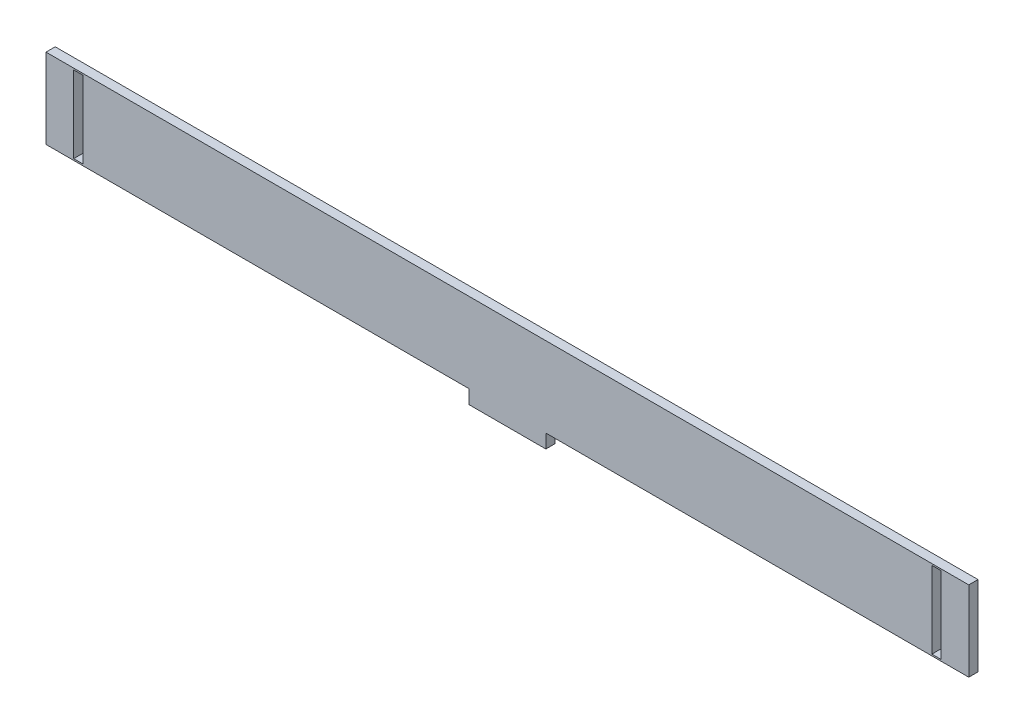
ISO-10303-21;
HEADER;
FILE_DESCRIPTION(('STEP AP214'),'2;1');
FILE_NAME('part.step','',(''),(''),'','','');
FILE_SCHEMA(('AUTOMOTIVE_DESIGN { 1 0 10303 214 1 1 1 1 }'));
ENDSEC;
DATA;
#1=APPLICATION_CONTEXT('core data for automotive mechanical design processes');
#2=APPLICATION_PROTOCOL_DEFINITION('international standard','automotive_design',2000,#1);
#3=PRODUCT_CONTEXT('',#1,'mechanical');
#4=PRODUCT('Part','Part','',(#3));
#5=PRODUCT_RELATED_PRODUCT_CATEGORY('part','',(#4));
#6=PRODUCT_DEFINITION_FORMATION('','',#4);
#7=PRODUCT_DEFINITION_CONTEXT('part definition',#1,'design');
#8=PRODUCT_DEFINITION('design','',#6,#7);
#9=PRODUCT_DEFINITION_SHAPE('','',#8);
#10=(LENGTH_UNIT() NAMED_UNIT(*) SI_UNIT(.MILLI.,.METRE.));
#11=(NAMED_UNIT(*) PLANE_ANGLE_UNIT() SI_UNIT($,.RADIAN.));
#12=(NAMED_UNIT(*) SI_UNIT($,.STERADIAN.) SOLID_ANGLE_UNIT());
#13=UNCERTAINTY_MEASURE_WITH_UNIT(LENGTH_MEASURE(1.E-05),#10,'distance_accuracy_value','');
#14=(GEOMETRIC_REPRESENTATION_CONTEXT(3) GLOBAL_UNCERTAINTY_ASSIGNED_CONTEXT((#13)) GLOBAL_UNIT_ASSIGNED_CONTEXT((#10,
#11,#12)) REPRESENTATION_CONTEXT('',''));
#15=CARTESIAN_POINT('',(0.,0.,0.));
#16=DIRECTION('',(0.,0.,1.));
#17=DIRECTION('',(1.,0.,0.));
#18=AXIS2_PLACEMENT_3D('',#15,#16,#17);
#19=CARTESIAN_POINT('',(0.,0.,6.));
#20=DIRECTION('',(0.,0.,1.));
#21=DIRECTION('',(1.,0.,0.));
#22=AXIS2_PLACEMENT_3D('',#19,#20,#21);
#23=PLANE('',#22);
#24=DIRECTION('',(0.,-1.,0.));
#25=VECTOR('',#24,1.);
#26=CARTESIAN_POINT('',(0.,0.,6.));
#27=LINE('',#26,#25);
#28=CARTESIAN_POINT('',(0.,0.,6.));
#29=VERTEX_POINT('',#28);
#30=CARTESIAN_POINT('',(0.,-52.,6.));
#31=VERTEX_POINT('',#30);
#32=EDGE_CURVE('E215',#29,#31,#27,.T.);
#33=ORIENTED_EDGE('',*,*,#32,.T.);
#34=DIRECTION('',(1.,0.,0.));
#35=VECTOR('',#34,1.);
#36=CARTESIAN_POINT('',(0.,-52.,6.));
#37=LINE('',#36,#35);
#38=CARTESIAN_POINT('',(275.,-52.,6.));
#39=VERTEX_POINT('',#38);
#40=EDGE_CURVE('E218',#31,#39,#37,.T.);
#41=ORIENTED_EDGE('',*,*,#40,.T.);
#42=DIRECTION('',(0.,-1.,0.));
#43=VECTOR('',#42,1.);
#44=CARTESIAN_POINT('',(275.,-52.,6.));
#45=LINE('',#44,#43);
#46=CARTESIAN_POINT('',(275.,-61.,6.));
#47=VERTEX_POINT('',#46);
#48=EDGE_CURVE('E221',#39,#47,#45,.T.);
#49=ORIENTED_EDGE('',*,*,#48,.T.);
#50=DIRECTION('',(1.,0.,0.));
#51=VECTOR('',#50,1.);
#52=CARTESIAN_POINT('',(275.,-61.,6.));
#53=LINE('',#52,#51);
#54=CARTESIAN_POINT('',(325.,-61.,6.));
#55=VERTEX_POINT('',#54);
#56=EDGE_CURVE('E223',#47,#55,#53,.T.);
#57=ORIENTED_EDGE('',*,*,#56,.T.);
#58=DIRECTION('',(0.,1.,0.));
#59=VECTOR('',#58,1.);
#60=CARTESIAN_POINT('',(325.,-52.,6.));
#61=LINE('',#60,#59);
#62=CARTESIAN_POINT('',(325.,-52.,6.));
#63=VERTEX_POINT('',#62);
#64=EDGE_CURVE('E225',#55,#63,#61,.T.);
#65=ORIENTED_EDGE('',*,*,#64,.T.);
#66=DIRECTION('',(1.,0.,0.));
#67=VECTOR('',#66,1.);
#68=CARTESIAN_POINT('',(325.,-52.,6.));
#69=LINE('',#68,#67);
#70=CARTESIAN_POINT('',(600.,-51.9999999999999,6.));
#71=VERTEX_POINT('',#70);
#72=EDGE_CURVE('E227',#63,#71,#69,.T.);
#73=ORIENTED_EDGE('',*,*,#72,.T.);
#74=DIRECTION('',(0.,1.,0.));
#75=VECTOR('',#74,1.);
#76=CARTESIAN_POINT('',(600.,0.,6.));
#77=LINE('',#76,#75);
#78=CARTESIAN_POINT('',(600.,0.,6.));
#79=VERTEX_POINT('',#78);
#80=EDGE_CURVE('E229',#71,#79,#77,.T.);
#81=ORIENTED_EDGE('',*,*,#80,.T.);
#82=DIRECTION('',(-1.,0.,0.));
#83=VECTOR('',#82,1.);
#84=CARTESIAN_POINT('',(0.,0.,6.));
#85=LINE('',#84,#83);
#86=EDGE_CURVE('E231',#79,#29,#85,.T.);
#87=ORIENTED_EDGE('',*,*,#86,.T.);
#88=EDGE_LOOP('',(#33,#41,#49,#57,#65,#73,#81,#87));
#89=FACE_BOUND('',#88,.T.);
#90=DIRECTION('',(-1.,0.,0.));
#91=VECTOR('',#90,1.);
#92=CARTESIAN_POINT('',(18.,-0.999999999999928,6.));
#93=LINE('',#92,#91);
#94=CARTESIAN_POINT('',(24.,-0.999999999999929,6.));
#95=VERTEX_POINT('',#94);
#96=CARTESIAN_POINT('',(18.,-0.999999999999928,6.));
#97=VERTEX_POINT('',#96);
#98=EDGE_CURVE('E186',#95,#97,#93,.T.);
#99=ORIENTED_EDGE('',*,*,#98,.F.);
#100=DIRECTION('',(0.,1.,0.));
#101=VECTOR('',#100,1.);
#102=CARTESIAN_POINT('',(24.,-0.999999999999929,6.));
#103=LINE('',#102,#101);
#104=CARTESIAN_POINT('',(24.,-50.9999999999999,6.));
#105=VERTEX_POINT('',#104);
#106=EDGE_CURVE('E184',#105,#95,#103,.T.);
#107=ORIENTED_EDGE('',*,*,#106,.F.);
#108=DIRECTION('',(1.,0.,0.));
#109=VECTOR('',#108,1.);
#110=CARTESIAN_POINT('',(18.,-50.9999999999999,6.));
#111=LINE('',#110,#109);
#112=CARTESIAN_POINT('',(18.,-50.9999999999999,6.));
#113=VERTEX_POINT('',#112);
#114=EDGE_CURVE('E192',#113,#105,#111,.T.);
#115=ORIENTED_EDGE('',*,*,#114,.F.);
#116=DIRECTION('',(0.,-1.,0.));
#117=VECTOR('',#116,1.);
#118=CARTESIAN_POINT('',(18.,-0.999999999999928,6.));
#119=LINE('',#118,#117);
#120=EDGE_CURVE('E189',#97,#113,#119,.T.);
#121=ORIENTED_EDGE('',*,*,#120,.F.);
#122=EDGE_LOOP('',(#99,#107,#115,#121));
#123=FACE_BOUND('',#122,.T.);
#124=DIRECTION('',(-1.,0.,0.));
#125=VECTOR('',#124,1.);
#126=CARTESIAN_POINT('',(582.,-0.999999999999859,6.));
#127=LINE('',#126,#125);
#128=CARTESIAN_POINT('',(582.,-0.999999999999859,6.));
#129=VERTEX_POINT('',#128);
#130=CARTESIAN_POINT('',(576.,-0.999999999999861,6.));
#131=VERTEX_POINT('',#130);
#132=EDGE_CURVE('E156',#129,#131,#127,.T.);
#133=ORIENTED_EDGE('',*,*,#132,.F.);
#134=DIRECTION('',(0.,1.,0.));
#135=VECTOR('',#134,1.);
#136=CARTESIAN_POINT('',(582.,-0.999999999999859,6.));
#137=LINE('',#136,#135);
#138=CARTESIAN_POINT('',(582.,-50.9999999999999,6.));
#139=VERTEX_POINT('',#138);
#140=EDGE_CURVE('E148',#139,#129,#137,.T.);
#141=ORIENTED_EDGE('',*,*,#140,.F.);
#142=DIRECTION('',(1.,0.,0.));
#143=VECTOR('',#142,1.);
#144=CARTESIAN_POINT('',(582.,-50.9999999999999,6.));
#145=LINE('',#144,#143);
#146=CARTESIAN_POINT('',(576.,-50.9999999999999,6.));
#147=VERTEX_POINT('',#146);
#148=EDGE_CURVE('E170',#147,#139,#145,.T.);
#149=ORIENTED_EDGE('',*,*,#148,.F.);
#150=DIRECTION('',(0.,-1.,0.));
#151=VECTOR('',#150,1.);
#152=CARTESIAN_POINT('',(576.,-0.999999999999861,6.));
#153=LINE('',#152,#151);
#154=EDGE_CURVE('E168',#131,#147,#153,.T.);
#155=ORIENTED_EDGE('',*,*,#154,.F.);
#156=EDGE_LOOP('',(#133,#141,#149,#155));
#157=FACE_BOUND('',#156,.T.);
#158=ADVANCED_FACE('F35',(#89,#123,#157),#23,.T.);
#159=CARTESIAN_POINT('',(0.,0.,0.));
#160=DIRECTION('',(0.,0.,1.));
#161=DIRECTION('',(1.,0.,0.));
#162=AXIS2_PLACEMENT_3D('',#159,#160,#161);
#163=PLANE('',#162);
#164=DIRECTION('',(0.,1.,0.));
#165=VECTOR('',#164,1.);
#166=CARTESIAN_POINT('',(24.,-0.999999999999929,0.));
#167=LINE('',#166,#165);
#168=CARTESIAN_POINT('',(24.,-50.9999999999999,0.));
#169=VERTEX_POINT('',#168);
#170=CARTESIAN_POINT('',(24.,-0.999999999999929,0.));
#171=VERTEX_POINT('',#170);
#172=EDGE_CURVE('E164',#169,#171,#167,.T.);
#173=ORIENTED_EDGE('',*,*,#172,.T.);
#174=DIRECTION('',(-1.,0.,0.));
#175=VECTOR('',#174,1.);
#176=CARTESIAN_POINT('',(18.,-0.999999999999928,0.));
#177=LINE('',#176,#175);
#178=CARTESIAN_POINT('',(18.,-0.999999999999928,0.));
#179=VERTEX_POINT('',#178);
#180=EDGE_CURVE('E197',#171,#179,#177,.T.);
#181=ORIENTED_EDGE('',*,*,#180,.T.);
#182=DIRECTION('',(0.,-1.,0.));
#183=VECTOR('',#182,1.);
#184=CARTESIAN_POINT('',(18.,-0.999999999999928,0.));
#185=LINE('',#184,#183);
#186=CARTESIAN_POINT('',(18.,-50.9999999999999,0.));
#187=VERTEX_POINT('',#186);
#188=EDGE_CURVE('E200',#179,#187,#185,.T.);
#189=ORIENTED_EDGE('',*,*,#188,.T.);
#190=DIRECTION('',(1.,0.,0.));
#191=VECTOR('',#190,1.);
#192=CARTESIAN_POINT('',(18.,-50.9999999999999,0.));
#193=LINE('',#192,#191);
#194=EDGE_CURVE('E187',#187,#169,#193,.T.);
#195=ORIENTED_EDGE('',*,*,#194,.T.);
#196=EDGE_LOOP('',(#173,#181,#189,#195));
#197=FACE_BOUND('',#196,.T.);
#198=DIRECTION('',(0.,-1.,0.));
#199=VECTOR('',#198,1.);
#200=CARTESIAN_POINT('',(0.,0.,0.));
#201=LINE('',#200,#199);
#202=CARTESIAN_POINT('',(0.,0.,0.));
#203=VERTEX_POINT('',#202);
#204=CARTESIAN_POINT('',(0.,-52.,0.));
#205=VERTEX_POINT('',#204);
#206=EDGE_CURVE('E214',#203,#205,#201,.T.);
#207=ORIENTED_EDGE('',*,*,#206,.F.);
#208=DIRECTION('',(-1.,0.,0.));
#209=VECTOR('',#208,1.);
#210=CARTESIAN_POINT('',(0.,0.,0.));
#211=LINE('',#210,#209);
#212=CARTESIAN_POINT('',(600.,0.,0.));
#213=VERTEX_POINT('',#212);
#214=EDGE_CURVE('E219',#213,#203,#211,.T.);
#215=ORIENTED_EDGE('',*,*,#214,.F.);
#216=DIRECTION('',(0.,1.,0.));
#217=VECTOR('',#216,1.);
#218=CARTESIAN_POINT('',(600.,0.,0.));
#219=LINE('',#218,#217);
#220=CARTESIAN_POINT('',(600.,-51.9999999999999,0.));
#221=VERTEX_POINT('',#220);
#222=EDGE_CURVE('E246',#221,#213,#219,.T.);
#223=ORIENTED_EDGE('',*,*,#222,.F.);
#224=DIRECTION('',(1.,0.,0.));
#225=VECTOR('',#224,1.);
#226=CARTESIAN_POINT('',(325.,-52.,0.));
#227=LINE('',#226,#225);
#228=CARTESIAN_POINT('',(325.,-52.,0.));
#229=VERTEX_POINT('',#228);
#230=EDGE_CURVE('E244',#229,#221,#227,.T.);
#231=ORIENTED_EDGE('',*,*,#230,.F.);
#232=DIRECTION('',(0.,1.,0.));
#233=VECTOR('',#232,1.);
#234=CARTESIAN_POINT('',(325.,-52.,0.));
#235=LINE('',#234,#233);
#236=CARTESIAN_POINT('',(325.,-61.,0.));
#237=VERTEX_POINT('',#236);
#238=EDGE_CURVE('E242',#237,#229,#235,.T.);
#239=ORIENTED_EDGE('',*,*,#238,.F.);
#240=DIRECTION('',(1.,0.,0.));
#241=VECTOR('',#240,1.);
#242=CARTESIAN_POINT('',(275.,-61.,0.));
#243=LINE('',#242,#241);
#244=CARTESIAN_POINT('',(275.,-61.,0.));
#245=VERTEX_POINT('',#244);
#246=EDGE_CURVE('E240',#245,#237,#243,.T.);
#247=ORIENTED_EDGE('',*,*,#246,.F.);
#248=DIRECTION('',(0.,-1.,0.));
#249=VECTOR('',#248,1.);
#250=CARTESIAN_POINT('',(275.,-52.,0.));
#251=LINE('',#250,#249);
#252=CARTESIAN_POINT('',(275.,-52.,0.));
#253=VERTEX_POINT('',#252);
#254=EDGE_CURVE('E238',#253,#245,#251,.T.);
#255=ORIENTED_EDGE('',*,*,#254,.F.);
#256=DIRECTION('',(1.,0.,0.));
#257=VECTOR('',#256,1.);
#258=CARTESIAN_POINT('',(0.,-52.,0.));
#259=LINE('',#258,#257);
#260=EDGE_CURVE('E236',#205,#253,#259,.T.);
#261=ORIENTED_EDGE('',*,*,#260,.F.);
#262=EDGE_LOOP('',(#207,#215,#223,#231,#239,#247,#255,#261));
#263=FACE_BOUND('',#262,.T.);
#264=DIRECTION('',(0.,1.,0.));
#265=VECTOR('',#264,1.);
#266=CARTESIAN_POINT('',(582.,-0.999999999999859,0.));
#267=LINE('',#266,#265);
#268=CARTESIAN_POINT('',(582.,-50.9999999999999,0.));
#269=VERTEX_POINT('',#268);
#270=CARTESIAN_POINT('',(582.,-0.999999999999859,0.));
#271=VERTEX_POINT('',#270);
#272=EDGE_CURVE('E58',#269,#271,#267,.T.);
#273=ORIENTED_EDGE('',*,*,#272,.T.);
#274=DIRECTION('',(-1.,0.,0.));
#275=VECTOR('',#274,1.);
#276=CARTESIAN_POINT('',(582.,-0.999999999999859,0.));
#277=LINE('',#276,#275);
#278=CARTESIAN_POINT('',(576.,-0.999999999999861,0.));
#279=VERTEX_POINT('',#278);
#280=EDGE_CURVE('E163',#271,#279,#277,.T.);
#281=ORIENTED_EDGE('',*,*,#280,.T.);
#282=DIRECTION('',(0.,-1.,0.));
#283=VECTOR('',#282,1.);
#284=CARTESIAN_POINT('',(576.,-0.999999999999861,0.));
#285=LINE('',#284,#283);
#286=CARTESIAN_POINT('',(576.,-50.9999999999999,0.));
#287=VERTEX_POINT('',#286);
#288=EDGE_CURVE('E176',#279,#287,#285,.T.);
#289=ORIENTED_EDGE('',*,*,#288,.T.);
#290=DIRECTION('',(1.,0.,0.));
#291=VECTOR('',#290,1.);
#292=CARTESIAN_POINT('',(582.,-50.9999999999999,0.));
#293=LINE('',#292,#291);
#294=EDGE_CURVE('E157',#287,#269,#293,.T.);
#295=ORIENTED_EDGE('',*,*,#294,.T.);
#296=EDGE_LOOP('',(#273,#281,#289,#295));
#297=FACE_BOUND('',#296,.T.);
#298=ADVANCED_FACE('F276',(#197,#263,#297),#163,.F.);
#299=CARTESIAN_POINT('',(0.,0.,6.));
#300=DIRECTION('',(1.,0.,0.));
#301=DIRECTION('',(0.,1.,0.));
#302=AXIS2_PLACEMENT_3D('',#299,#300,#301);
#303=PLANE('',#302);
#304=ORIENTED_EDGE('',*,*,#206,.T.);
#305=DIRECTION('',(0.,0.,-1.));
#306=VECTOR('',#305,1.);
#307=CARTESIAN_POINT('',(0.,-52.,6.));
#308=LINE('',#307,#306);
#309=EDGE_CURVE('E11',#31,#205,#308,.T.);
#310=ORIENTED_EDGE('',*,*,#309,.F.);
#311=ORIENTED_EDGE('',*,*,#32,.F.);
#312=DIRECTION('',(0.,0.,-1.));
#313=VECTOR('',#312,1.);
#314=CARTESIAN_POINT('',(0.,0.,6.));
#315=LINE('',#314,#313);
#316=EDGE_CURVE('E233',#29,#203,#315,.T.);
#317=ORIENTED_EDGE('',*,*,#316,.T.);
#318=EDGE_LOOP('',(#304,#310,#311,#317));
#319=FACE_BOUND('',#318,.T.);
#320=ADVANCED_FACE('F37',(#319),#303,.F.);
#321=CARTESIAN_POINT('',(0.,-52.,6.));
#322=DIRECTION('',(0.,1.,0.));
#323=DIRECTION('',(0.,0.,1.));
#324=AXIS2_PLACEMENT_3D('',#321,#322,#323);
#325=PLANE('',#324);
#326=ORIENTED_EDGE('',*,*,#260,.T.);
#327=DIRECTION('',(0.,0.,-1.));
#328=VECTOR('',#327,1.);
#329=CARTESIAN_POINT('',(275.,-52.,6.));
#330=LINE('',#329,#328);
#331=EDGE_CURVE('E43',#39,#253,#330,.T.);
#332=ORIENTED_EDGE('',*,*,#331,.F.);
#333=ORIENTED_EDGE('',*,*,#40,.F.);
#334=ORIENTED_EDGE('',*,*,#309,.T.);
#335=EDGE_LOOP('',(#326,#332,#333,#334));
#336=FACE_BOUND('',#335,.T.);
#337=ADVANCED_FACE('F294',(#336),#325,.F.);
#338=CARTESIAN_POINT('',(275.,-52.,6.));
#339=DIRECTION('',(1.,0.,0.));
#340=DIRECTION('',(0.,1.,0.));
#341=AXIS2_PLACEMENT_3D('',#338,#339,#340);
#342=PLANE('',#341);
#343=ORIENTED_EDGE('',*,*,#254,.T.);
#344=DIRECTION('',(0.,0.,-1.));
#345=VECTOR('',#344,1.);
#346=CARTESIAN_POINT('',(275.,-61.,6.));
#347=LINE('',#346,#345);
#348=EDGE_CURVE('E263',#47,#245,#347,.T.);
#349=ORIENTED_EDGE('',*,*,#348,.F.);
#350=ORIENTED_EDGE('',*,*,#48,.F.);
#351=ORIENTED_EDGE('',*,*,#331,.T.);
#352=EDGE_LOOP('',(#343,#349,#350,#351));
#353=FACE_BOUND('',#352,.T.);
#354=ADVANCED_FACE('F270',(#353),#342,.F.);
#355=CARTESIAN_POINT('',(275.,-61.,6.));
#356=DIRECTION('',(0.,1.,0.));
#357=DIRECTION('',(-1.,0.,0.));
#358=AXIS2_PLACEMENT_3D('',#355,#356,#357);
#359=PLANE('',#358);
#360=ORIENTED_EDGE('',*,*,#246,.T.);
#361=DIRECTION('',(0.,0.,-1.));
#362=VECTOR('',#361,1.);
#363=CARTESIAN_POINT('',(325.,-61.,6.));
#364=LINE('',#363,#362);
#365=EDGE_CURVE('E260',#55,#237,#364,.T.);
#366=ORIENTED_EDGE('',*,*,#365,.F.);
#367=ORIENTED_EDGE('',*,*,#56,.F.);
#368=ORIENTED_EDGE('',*,*,#348,.T.);
#369=EDGE_LOOP('',(#360,#366,#367,#368));
#370=FACE_BOUND('',#369,.T.);
#371=ADVANCED_FACE('F282',(#370),#359,.F.);
#372=CARTESIAN_POINT('',(325.,-52.,6.));
#373=DIRECTION('',(-1.,0.,0.));
#374=DIRECTION('',(0.,0.,1.));
#375=AXIS2_PLACEMENT_3D('',#372,#373,#374);
#376=PLANE('',#375);
#377=ORIENTED_EDGE('',*,*,#238,.T.);
#378=DIRECTION('',(0.,0.,-1.));
#379=VECTOR('',#378,1.);
#380=CARTESIAN_POINT('',(325.,-52.,6.));
#381=LINE('',#380,#379);
#382=EDGE_CURVE('E257',#63,#229,#381,.T.);
#383=ORIENTED_EDGE('',*,*,#382,.F.);
#384=ORIENTED_EDGE('',*,*,#64,.F.);
#385=ORIENTED_EDGE('',*,*,#365,.T.);
#386=EDGE_LOOP('',(#377,#383,#384,#385));
#387=FACE_BOUND('',#386,.T.);
#388=ADVANCED_FACE('F286',(#387),#376,.F.);
#389=CARTESIAN_POINT('',(325.,-52.,6.));
#390=DIRECTION('',(0.,1.,0.));
#391=DIRECTION('',(-1.,0.,0.));
#392=AXIS2_PLACEMENT_3D('',#389,#390,#391);
#393=PLANE('',#392);
#394=ORIENTED_EDGE('',*,*,#230,.T.);
#395=DIRECTION('',(0.,0.,-1.));
#396=VECTOR('',#395,1.);
#397=CARTESIAN_POINT('',(600.,-51.9999999999999,6.));
#398=LINE('',#397,#396);
#399=EDGE_CURVE('E254',#71,#221,#398,.T.);
#400=ORIENTED_EDGE('',*,*,#399,.F.);
#401=ORIENTED_EDGE('',*,*,#72,.F.);
#402=ORIENTED_EDGE('',*,*,#382,.T.);
#403=EDGE_LOOP('',(#394,#400,#401,#402));
#404=FACE_BOUND('',#403,.T.);
#405=ADVANCED_FACE('F307',(#404),#393,.F.);
#406=CARTESIAN_POINT('',(600.,0.,6.));
#407=DIRECTION('',(-1.,0.,0.));
#408=DIRECTION('',(0.,0.,1.));
#409=AXIS2_PLACEMENT_3D('',#406,#407,#408);
#410=PLANE('',#409);
#411=ORIENTED_EDGE('',*,*,#222,.T.);
#412=DIRECTION('',(0.,0.,-1.));
#413=VECTOR('',#412,1.);
#414=CARTESIAN_POINT('',(600.,0.,6.));
#415=LINE('',#414,#413);
#416=EDGE_CURVE('E251',#79,#213,#415,.T.);
#417=ORIENTED_EDGE('',*,*,#416,.F.);
#418=ORIENTED_EDGE('',*,*,#80,.F.);
#419=ORIENTED_EDGE('',*,*,#399,.T.);
#420=EDGE_LOOP('',(#411,#417,#418,#419));
#421=FACE_BOUND('',#420,.T.);
#422=ADVANCED_FACE('F305',(#421),#410,.F.);
#423=CARTESIAN_POINT('',(0.,0.,6.));
#424=DIRECTION('',(0.,-1.,0.));
#425=DIRECTION('',(1.,0.,0.));
#426=AXIS2_PLACEMENT_3D('',#423,#424,#425);
#427=PLANE('',#426);
#428=ORIENTED_EDGE('',*,*,#214,.T.);
#429=ORIENTED_EDGE('',*,*,#316,.F.);
#430=ORIENTED_EDGE('',*,*,#86,.F.);
#431=ORIENTED_EDGE('',*,*,#416,.T.);
#432=EDGE_LOOP('',(#428,#429,#430,#431));
#433=FACE_BOUND('',#432,.T.);
#434=ADVANCED_FACE('F300',(#433),#427,.F.);
#435=CARTESIAN_POINT('',(24.,-0.999999999999929,6.));
#436=DIRECTION('',(-1.,0.,0.));
#437=DIRECTION('',(0.,-1.,0.));
#438=AXIS2_PLACEMENT_3D('',#435,#436,#437);
#439=PLANE('',#438);
#440=ORIENTED_EDGE('',*,*,#172,.F.);
#441=DIRECTION('',(0.,0.,-1.));
#442=VECTOR('',#441,1.);
#443=CARTESIAN_POINT('',(24.,-50.9999999999999,6.));
#444=LINE('',#443,#442);
#445=EDGE_CURVE('E194',#105,#169,#444,.T.);
#446=ORIENTED_EDGE('',*,*,#445,.F.);
#447=ORIENTED_EDGE('',*,*,#106,.T.);
#448=DIRECTION('',(0.,0.,-1.));
#449=VECTOR('',#448,1.);
#450=CARTESIAN_POINT('',(24.,-0.999999999999929,6.));
#451=LINE('',#450,#449);
#452=EDGE_CURVE('E211',#95,#171,#451,.T.);
#453=ORIENTED_EDGE('',*,*,#452,.T.);
#454=EDGE_LOOP('',(#440,#446,#447,#453));
#455=FACE_BOUND('',#454,.T.);
#456=ADVANCED_FACE('F324',(#455),#439,.T.);
#457=CARTESIAN_POINT('',(18.,-0.999999999999928,6.));
#458=DIRECTION('',(0.,-1.,0.));
#459=DIRECTION('',(1.,0.,0.));
#460=AXIS2_PLACEMENT_3D('',#457,#458,#459);
#461=PLANE('',#460);
#462=ORIENTED_EDGE('',*,*,#180,.F.);
#463=ORIENTED_EDGE('',*,*,#452,.F.);
#464=ORIENTED_EDGE('',*,*,#98,.T.);
#465=DIRECTION('',(0.,0.,-1.));
#466=VECTOR('',#465,1.);
#467=CARTESIAN_POINT('',(18.,-0.999999999999928,6.));
#468=LINE('',#467,#466);
#469=EDGE_CURVE('E209',#97,#179,#468,.T.);
#470=ORIENTED_EDGE('',*,*,#469,.T.);
#471=EDGE_LOOP('',(#462,#463,#464,#470));
#472=FACE_BOUND('',#471,.T.);
#473=ADVANCED_FACE('F331',(#472),#461,.T.);
#474=CARTESIAN_POINT('',(18.,-0.999999999999928,6.));
#475=DIRECTION('',(1.,0.,0.));
#476=DIRECTION('',(0.,1.,0.));
#477=AXIS2_PLACEMENT_3D('',#474,#475,#476);
#478=PLANE('',#477);
#479=ORIENTED_EDGE('',*,*,#188,.F.);
#480=ORIENTED_EDGE('',*,*,#469,.F.);
#481=ORIENTED_EDGE('',*,*,#120,.T.);
#482=DIRECTION('',(0.,0.,-1.));
#483=VECTOR('',#482,1.);
#484=CARTESIAN_POINT('',(18.,-50.9999999999999,6.));
#485=LINE('',#484,#483);
#486=EDGE_CURVE('E207',#113,#187,#485,.T.);
#487=ORIENTED_EDGE('',*,*,#486,.T.);
#488=EDGE_LOOP('',(#479,#480,#481,#487));
#489=FACE_BOUND('',#488,.T.);
#490=ADVANCED_FACE('F336',(#489),#478,.T.);
#491=CARTESIAN_POINT('',(18.,-50.9999999999999,6.));
#492=DIRECTION('',(0.,1.,0.));
#493=DIRECTION('',(0.,0.,1.));
#494=AXIS2_PLACEMENT_3D('',#491,#492,#493);
#495=PLANE('',#494);
#496=ORIENTED_EDGE('',*,*,#194,.F.);
#497=ORIENTED_EDGE('',*,*,#486,.F.);
#498=ORIENTED_EDGE('',*,*,#114,.T.);
#499=ORIENTED_EDGE('',*,*,#445,.T.);
#500=EDGE_LOOP('',(#496,#497,#498,#499));
#501=FACE_BOUND('',#500,.T.);
#502=ADVANCED_FACE('F343',(#501),#495,.T.);
#503=CARTESIAN_POINT('',(582.,-0.999999999999859,6.));
#504=DIRECTION('',(-1.,0.,0.));
#505=DIRECTION('',(0.,0.,1.));
#506=AXIS2_PLACEMENT_3D('',#503,#504,#505);
#507=PLANE('',#506);
#508=ORIENTED_EDGE('',*,*,#272,.F.);
#509=DIRECTION('',(0.,0.,-1.));
#510=VECTOR('',#509,1.);
#511=CARTESIAN_POINT('',(582.,-50.9999999999999,6.));
#512=LINE('',#511,#510);
#513=EDGE_CURVE('E152',#139,#269,#512,.T.);
#514=ORIENTED_EDGE('',*,*,#513,.F.);
#515=ORIENTED_EDGE('',*,*,#140,.T.);
#516=DIRECTION('',(0.,0.,-1.));
#517=VECTOR('',#516,1.);
#518=CARTESIAN_POINT('',(582.,-0.999999999999859,6.));
#519=LINE('',#518,#517);
#520=EDGE_CURVE('E151',#129,#271,#519,.T.);
#521=ORIENTED_EDGE('',*,*,#520,.T.);
#522=EDGE_LOOP('',(#508,#514,#515,#521));
#523=FACE_BOUND('',#522,.T.);
#524=ADVANCED_FACE('F150',(#523),#507,.T.);
#525=CARTESIAN_POINT('',(582.,-0.999999999999859,6.));
#526=DIRECTION('',(0.,-1.,0.));
#527=DIRECTION('',(1.,0.,0.));
#528=AXIS2_PLACEMENT_3D('',#525,#526,#527);
#529=PLANE('',#528);
#530=ORIENTED_EDGE('',*,*,#280,.F.);
#531=ORIENTED_EDGE('',*,*,#520,.F.);
#532=ORIENTED_EDGE('',*,*,#132,.T.);
#533=DIRECTION('',(0.,0.,-1.));
#534=VECTOR('',#533,1.);
#535=CARTESIAN_POINT('',(576.,-0.999999999999861,6.));
#536=LINE('',#535,#534);
#537=EDGE_CURVE('E165',#131,#279,#536,.T.);
#538=ORIENTED_EDGE('',*,*,#537,.T.);
#539=EDGE_LOOP('',(#530,#531,#532,#538));
#540=FACE_BOUND('',#539,.T.);
#541=ADVANCED_FACE('F160',(#540),#529,.T.);
#542=CARTESIAN_POINT('',(576.,-0.999999999999861,6.));
#543=DIRECTION('',(1.,0.,0.));
#544=DIRECTION('',(0.,0.,-1.));
#545=AXIS2_PLACEMENT_3D('',#542,#543,#544);
#546=PLANE('',#545);
#547=ORIENTED_EDGE('',*,*,#288,.F.);
#548=ORIENTED_EDGE('',*,*,#537,.F.);
#549=ORIENTED_EDGE('',*,*,#154,.T.);
#550=DIRECTION('',(0.,0.,-1.));
#551=VECTOR('',#550,1.);
#552=CARTESIAN_POINT('',(576.,-50.9999999999999,6.));
#553=LINE('',#552,#551);
#554=EDGE_CURVE('E50',#147,#287,#553,.T.);
#555=ORIENTED_EDGE('',*,*,#554,.T.);
#556=EDGE_LOOP('',(#547,#548,#549,#555));
#557=FACE_BOUND('',#556,.T.);
#558=ADVANCED_FACE('F361',(#557),#546,.T.);
#559=CARTESIAN_POINT('',(582.,-50.9999999999999,6.));
#560=DIRECTION('',(0.,1.,0.));
#561=DIRECTION('',(0.,0.,1.));
#562=AXIS2_PLACEMENT_3D('',#559,#560,#561);
#563=PLANE('',#562);
#564=ORIENTED_EDGE('',*,*,#294,.F.);
#565=ORIENTED_EDGE('',*,*,#554,.F.);
#566=ORIENTED_EDGE('',*,*,#148,.T.);
#567=ORIENTED_EDGE('',*,*,#513,.T.);
#568=EDGE_LOOP('',(#564,#565,#566,#567));
#569=FACE_BOUND('',#568,.T.);
#570=ADVANCED_FACE('F364',(#569),#563,.T.);
#571=CLOSED_SHELL('',(#158,#298,#320,#337,#354,#371,#388,#405,#422,#434,#456,#473,#490,#502,
#524,#541,#558,#570));
#572=MANIFOLD_SOLID_BREP('B2',#571);
#573=ADVANCED_BREP_SHAPE_REPRESENTATION('',(#18,#572),#14);
#574=SHAPE_DEFINITION_REPRESENTATION(#9,#573);
ENDSEC;
END-ISO-10303-21;
